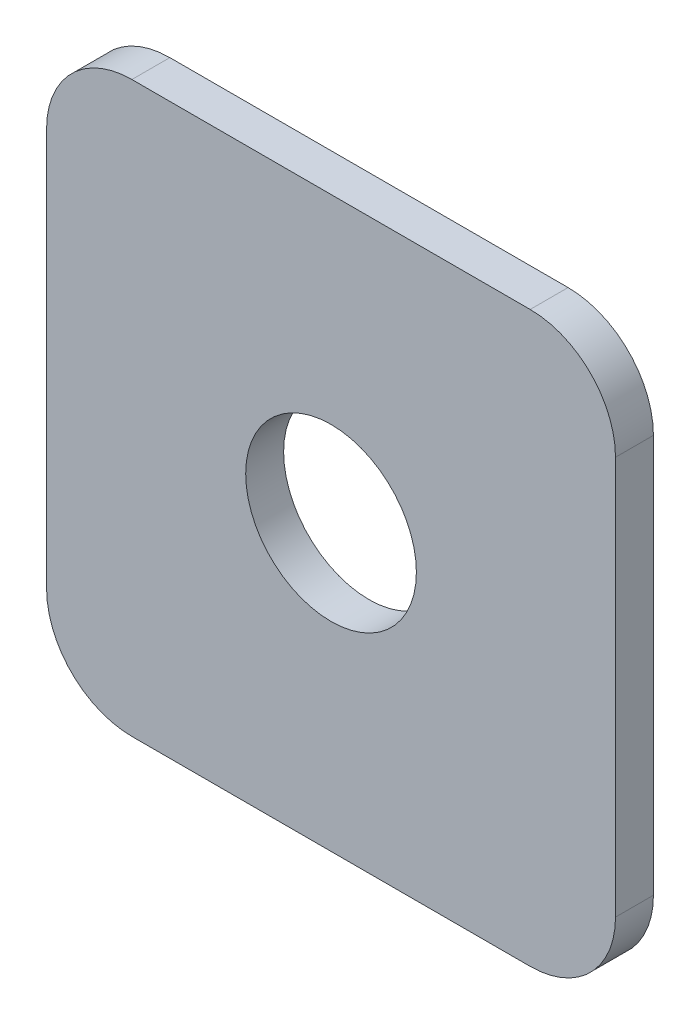
ISO-10303-21;
HEADER;
FILE_DESCRIPTION(('STEP AP214'),'2;1');
FILE_NAME('part.step','',(''),(''),'','','');
FILE_SCHEMA(('AUTOMOTIVE_DESIGN { 1 0 10303 214 1 1 1 1 }'));
ENDSEC;
DATA;
#1=APPLICATION_CONTEXT('core data for automotive mechanical design processes');
#2=APPLICATION_PROTOCOL_DEFINITION('international standard','automotive_design',2000,#1);
#3=PRODUCT_CONTEXT('',#1,'mechanical');
#4=PRODUCT('Part','Part','',(#3));
#5=PRODUCT_RELATED_PRODUCT_CATEGORY('part','',(#4));
#6=PRODUCT_DEFINITION_FORMATION('','',#4);
#7=PRODUCT_DEFINITION_CONTEXT('part definition',#1,'design');
#8=PRODUCT_DEFINITION('design','',#6,#7);
#9=PRODUCT_DEFINITION_SHAPE('','',#8);
#10=(LENGTH_UNIT() NAMED_UNIT(*) SI_UNIT(.MILLI.,.METRE.));
#11=(NAMED_UNIT(*) PLANE_ANGLE_UNIT() SI_UNIT($,.RADIAN.));
#12=(NAMED_UNIT(*) SI_UNIT($,.STERADIAN.) SOLID_ANGLE_UNIT());
#13=UNCERTAINTY_MEASURE_WITH_UNIT(LENGTH_MEASURE(1.E-05),#10,'distance_accuracy_value','');
#14=(GEOMETRIC_REPRESENTATION_CONTEXT(3) GLOBAL_UNCERTAINTY_ASSIGNED_CONTEXT((#13)) GLOBAL_UNIT_ASSIGNED_CONTEXT((#10,
#11,#12)) REPRESENTATION_CONTEXT('',''));
#15=CARTESIAN_POINT('',(0.,0.,0.));
#16=DIRECTION('',(0.,0.,1.));
#17=DIRECTION('',(1.,0.,0.));
#18=AXIS2_PLACEMENT_3D('',#15,#16,#17);
#19=CARTESIAN_POINT('',(0.,0.,10.));
#20=DIRECTION('',(0.,0.,-1.));
#21=DIRECTION('',(-1.,0.,0.));
#22=AXIS2_PLACEMENT_3D('',#19,#20,#21);
#23=PLANE('',#22);
#24=DIRECTION('',(-1.,0.,0.));
#25=VECTOR('',#24,1.);
#26=CARTESIAN_POINT('',(0.,150.,10.));
#27=LINE('',#26,#25);
#28=CARTESIAN_POINT('',(127.5,150.,10.));
#29=VERTEX_POINT('',#28);
#30=CARTESIAN_POINT('',(22.5,150.,10.));
#31=VERTEX_POINT('',#30);
#32=EDGE_CURVE('E136',#29,#31,#27,.T.);
#33=ORIENTED_EDGE('',*,*,#32,.T.);
#34=CARTESIAN_POINT('',(22.5,127.5,10.));
#35=DIRECTION('',(0.,0.,-1.));
#36=DIRECTION('',(-1.,0.,0.));
#37=AXIS2_PLACEMENT_3D('',#34,#35,#36);
#38=CIRCLE('',#37,22.5);
#39=CARTESIAN_POINT('',(0.,127.5,10.));
#40=VERTEX_POINT('',#39);
#41=EDGE_CURVE('E155',#31,#40,#38,.F.);
#42=ORIENTED_EDGE('',*,*,#41,.T.);
#43=DIRECTION('',(0.,-1.,0.));
#44=VECTOR('',#43,1.);
#45=CARTESIAN_POINT('',(0.,0.,10.));
#46=LINE('',#45,#44);
#47=CARTESIAN_POINT('',(0.,22.5,10.));
#48=VERTEX_POINT('',#47);
#49=EDGE_CURVE('E119',#40,#48,#46,.T.);
#50=ORIENTED_EDGE('',*,*,#49,.T.);
#51=CARTESIAN_POINT('',(22.5,22.5,10.));
#52=DIRECTION('',(0.,0.,-1.));
#53=DIRECTION('',(-1.,0.,0.));
#54=AXIS2_PLACEMENT_3D('',#51,#52,#53);
#55=CIRCLE('',#54,22.5);
#56=CARTESIAN_POINT('',(22.5,0.,10.));
#57=VERTEX_POINT('',#56);
#58=EDGE_CURVE('E153',#48,#57,#55,.F.);
#59=ORIENTED_EDGE('',*,*,#58,.T.);
#60=DIRECTION('',(1.,0.,0.));
#61=VECTOR('',#60,1.);
#62=CARTESIAN_POINT('',(0.,0.,10.));
#63=LINE('',#62,#61);
#64=CARTESIAN_POINT('',(127.5,0.,10.));
#65=VERTEX_POINT('',#64);
#66=EDGE_CURVE('E166',#57,#65,#63,.T.);
#67=ORIENTED_EDGE('',*,*,#66,.T.);
#68=CARTESIAN_POINT('',(127.5,22.5,10.));
#69=DIRECTION('',(0.,0.,-1.));
#70=DIRECTION('',(-1.,0.,0.));
#71=AXIS2_PLACEMENT_3D('',#68,#69,#70);
#72=CIRCLE('',#71,22.5);
#73=CARTESIAN_POINT('',(150.,22.5,10.));
#74=VERTEX_POINT('',#73);
#75=EDGE_CURVE('E54',#65,#74,#72,.F.);
#76=ORIENTED_EDGE('',*,*,#75,.T.);
#77=DIRECTION('',(0.,1.,0.));
#78=VECTOR('',#77,1.);
#79=CARTESIAN_POINT('',(150.,0.,10.));
#80=LINE('',#79,#78);
#81=CARTESIAN_POINT('',(150.,127.5,10.));
#82=VERTEX_POINT('',#81);
#83=EDGE_CURVE('E174',#74,#82,#80,.T.);
#84=ORIENTED_EDGE('',*,*,#83,.T.);
#85=CARTESIAN_POINT('',(127.5,127.5,10.));
#86=DIRECTION('',(0.,0.,-1.));
#87=DIRECTION('',(-1.,0.,0.));
#88=AXIS2_PLACEMENT_3D('',#85,#86,#87);
#89=CIRCLE('',#88,22.5);
#90=EDGE_CURVE('E150',#82,#29,#89,.F.);
#91=ORIENTED_EDGE('',*,*,#90,.T.);
#92=EDGE_LOOP('',(#33,#42,#50,#59,#67,#76,#84,#91));
#93=FACE_BOUND('',#92,.T.);
#94=CARTESIAN_POINT('',(75.,75.,10.));
#95=DIRECTION('',(0.,0.,1.));
#96=DIRECTION('',(1.,0.,0.));
#97=AXIS2_PLACEMENT_3D('',#94,#95,#96);
#98=CIRCLE('',#97,22.5);
#99=CARTESIAN_POINT('',(97.5,75.,10.));
#100=VERTEX_POINT('',#99);
#101=EDGE_CURVE('E127',#100,#100,#98,.T.);
#102=ORIENTED_EDGE('',*,*,#101,.F.);
#103=EDGE_LOOP('',(#102));
#104=FACE_BOUND('',#103,.T.);
#105=ADVANCED_FACE('F33',(#93,#104),#23,.F.);
#106=CARTESIAN_POINT('',(0.,0.,0.));
#107=DIRECTION('',(0.,0.,-1.));
#108=DIRECTION('',(-1.,0.,0.));
#109=AXIS2_PLACEMENT_3D('',#106,#107,#108);
#110=PLANE('',#109);
#111=DIRECTION('',(0.,-1.,0.));
#112=VECTOR('',#111,1.);
#113=CARTESIAN_POINT('',(0.,0.,0.));
#114=LINE('',#113,#112);
#115=CARTESIAN_POINT('',(0.,127.5,0.));
#116=VERTEX_POINT('',#115);
#117=CARTESIAN_POINT('',(0.,22.5,0.));
#118=VERTEX_POINT('',#117);
#119=EDGE_CURVE('E116',#116,#118,#114,.T.);
#120=ORIENTED_EDGE('',*,*,#119,.F.);
#121=CARTESIAN_POINT('',(22.5,127.5,0.));
#122=DIRECTION('',(0.,0.,-1.));
#123=DIRECTION('',(-1.,0.,0.));
#124=AXIS2_PLACEMENT_3D('',#121,#122,#123);
#125=CIRCLE('',#124,22.5);
#126=CARTESIAN_POINT('',(22.5,150.,0.));
#127=VERTEX_POINT('',#126);
#128=EDGE_CURVE('E99',#116,#127,#125,.T.);
#129=ORIENTED_EDGE('',*,*,#128,.T.);
#130=DIRECTION('',(-1.,0.,0.));
#131=VECTOR('',#130,1.);
#132=CARTESIAN_POINT('',(0.,150.,0.));
#133=LINE('',#132,#131);
#134=CARTESIAN_POINT('',(127.5,150.,0.));
#135=VERTEX_POINT('',#134);
#136=EDGE_CURVE('E140',#135,#127,#133,.T.);
#137=ORIENTED_EDGE('',*,*,#136,.F.);
#138=CARTESIAN_POINT('',(127.5,127.5,0.));
#139=DIRECTION('',(0.,0.,-1.));
#140=DIRECTION('',(-1.,0.,0.));
#141=AXIS2_PLACEMENT_3D('',#138,#139,#140);
#142=CIRCLE('',#141,22.5);
#143=CARTESIAN_POINT('',(150.,127.5,0.));
#144=VERTEX_POINT('',#143);
#145=EDGE_CURVE('E120',#135,#144,#142,.T.);
#146=ORIENTED_EDGE('',*,*,#145,.T.);
#147=DIRECTION('',(0.,1.,0.));
#148=VECTOR('',#147,1.);
#149=CARTESIAN_POINT('',(150.,0.,0.));
#150=LINE('',#149,#148);
#151=CARTESIAN_POINT('',(150.,22.5,0.));
#152=VERTEX_POINT('',#151);
#153=EDGE_CURVE('E130',#152,#144,#150,.T.);
#154=ORIENTED_EDGE('',*,*,#153,.F.);
#155=CARTESIAN_POINT('',(127.5,22.5,0.));
#156=DIRECTION('',(0.,0.,-1.));
#157=DIRECTION('',(-1.,0.,0.));
#158=AXIS2_PLACEMENT_3D('',#155,#156,#157);
#159=CIRCLE('',#158,22.5);
#160=CARTESIAN_POINT('',(127.5,0.,0.));
#161=VERTEX_POINT('',#160);
#162=EDGE_CURVE('E144',#152,#161,#159,.T.);
#163=ORIENTED_EDGE('',*,*,#162,.T.);
#164=DIRECTION('',(1.,0.,0.));
#165=VECTOR('',#164,1.);
#166=CARTESIAN_POINT('',(0.,0.,0.));
#167=LINE('',#166,#165);
#168=CARTESIAN_POINT('',(22.5,0.,0.));
#169=VERTEX_POINT('',#168);
#170=EDGE_CURVE('E126',#169,#161,#167,.T.);
#171=ORIENTED_EDGE('',*,*,#170,.F.);
#172=CARTESIAN_POINT('',(22.5,22.5,0.));
#173=DIRECTION('',(0.,0.,-1.));
#174=DIRECTION('',(-1.,0.,0.));
#175=AXIS2_PLACEMENT_3D('',#172,#173,#174);
#176=CIRCLE('',#175,22.5);
#177=EDGE_CURVE('E110',#169,#118,#176,.T.);
#178=ORIENTED_EDGE('',*,*,#177,.T.);
#179=EDGE_LOOP('',(#120,#129,#137,#146,#154,#163,#171,#178));
#180=FACE_BOUND('',#179,.T.);
#181=CARTESIAN_POINT('',(75.,75.,0.));
#182=DIRECTION('',(0.,0.,1.));
#183=DIRECTION('',(1.,0.,0.));
#184=AXIS2_PLACEMENT_3D('',#181,#182,#183);
#185=CIRCLE('',#184,22.5);
#186=CARTESIAN_POINT('',(97.5,75.,0.));
#187=VERTEX_POINT('',#186);
#188=EDGE_CURVE('E133',#187,#187,#185,.T.);
#189=ORIENTED_EDGE('',*,*,#188,.T.);
#190=EDGE_LOOP('',(#189));
#191=FACE_BOUND('',#190,.T.);
#192=ADVANCED_FACE('F123',(#180,#191),#110,.T.);
#193=CARTESIAN_POINT('',(0.,0.,10.));
#194=DIRECTION('',(1.,0.,0.));
#195=DIRECTION('',(0.,0.,-1.));
#196=AXIS2_PLACEMENT_3D('',#193,#194,#195);
#197=PLANE('',#196);
#198=ORIENTED_EDGE('',*,*,#49,.F.);
#199=DIRECTION('',(0.,0.,-1.));
#200=VECTOR('',#199,1.);
#201=CARTESIAN_POINT('',(0.,127.5,10.));
#202=LINE('',#201,#200);
#203=EDGE_CURVE('E103',#40,#116,#202,.T.);
#204=ORIENTED_EDGE('',*,*,#203,.T.);
#205=ORIENTED_EDGE('',*,*,#119,.T.);
#206=DIRECTION('',(0.,0.,-1.));
#207=VECTOR('',#206,1.);
#208=CARTESIAN_POINT('',(0.,22.5,10.));
#209=LINE('',#208,#207);
#210=EDGE_CURVE('E121',#118,#48,#209,.F.);
#211=ORIENTED_EDGE('',*,*,#210,.T.);
#212=EDGE_LOOP('',(#198,#204,#205,#211));
#213=FACE_BOUND('',#212,.T.);
#214=ADVANCED_FACE('F115',(#213),#197,.F.);
#215=CARTESIAN_POINT('',(0.,0.,10.));
#216=DIRECTION('',(0.,1.,0.));
#217=DIRECTION('',(0.,0.,1.));
#218=AXIS2_PLACEMENT_3D('',#215,#216,#217);
#219=PLANE('',#218);
#220=ORIENTED_EDGE('',*,*,#66,.F.);
#221=DIRECTION('',(0.,0.,-1.));
#222=VECTOR('',#221,1.);
#223=CARTESIAN_POINT('',(22.5,0.,10.));
#224=LINE('',#223,#222);
#225=EDGE_CURVE('E159',#57,#169,#224,.T.);
#226=ORIENTED_EDGE('',*,*,#225,.T.);
#227=ORIENTED_EDGE('',*,*,#170,.T.);
#228=DIRECTION('',(0.,0.,-1.));
#229=VECTOR('',#228,1.);
#230=CARTESIAN_POINT('',(127.5,0.,10.));
#231=LINE('',#230,#229);
#232=EDGE_CURVE('E157',#161,#65,#231,.F.);
#233=ORIENTED_EDGE('',*,*,#232,.T.);
#234=EDGE_LOOP('',(#220,#226,#227,#233));
#235=FACE_BOUND('',#234,.T.);
#236=ADVANCED_FACE('F164',(#235),#219,.F.);
#237=CARTESIAN_POINT('',(150.,0.,10.));
#238=DIRECTION('',(-1.,0.,0.));
#239=DIRECTION('',(0.,0.,1.));
#240=AXIS2_PLACEMENT_3D('',#237,#238,#239);
#241=PLANE('',#240);
#242=ORIENTED_EDGE('',*,*,#83,.F.);
#243=DIRECTION('',(0.,0.,-1.));
#244=VECTOR('',#243,1.);
#245=CARTESIAN_POINT('',(150.,22.5,10.));
#246=LINE('',#245,#244);
#247=EDGE_CURVE('E11',#74,#152,#246,.T.);
#248=ORIENTED_EDGE('',*,*,#247,.T.);
#249=ORIENTED_EDGE('',*,*,#153,.T.);
#250=DIRECTION('',(0.,0.,-1.));
#251=VECTOR('',#250,1.);
#252=CARTESIAN_POINT('',(150.,127.5,10.));
#253=LINE('',#252,#251);
#254=EDGE_CURVE('E41',#144,#82,#253,.F.);
#255=ORIENTED_EDGE('',*,*,#254,.T.);
#256=EDGE_LOOP('',(#242,#248,#249,#255));
#257=FACE_BOUND('',#256,.T.);
#258=ADVANCED_FACE('F173',(#257),#241,.F.);
#259=CARTESIAN_POINT('',(0.,150.,10.));
#260=DIRECTION('',(0.,-1.,0.));
#261=DIRECTION('',(0.,0.,-1.));
#262=AXIS2_PLACEMENT_3D('',#259,#260,#261);
#263=PLANE('',#262);
#264=ORIENTED_EDGE('',*,*,#136,.T.);
#265=DIRECTION('',(0.,0.,-1.));
#266=VECTOR('',#265,1.);
#267=CARTESIAN_POINT('',(22.5,150.,10.));
#268=LINE('',#267,#266);
#269=EDGE_CURVE('E104',#127,#31,#268,.F.);
#270=ORIENTED_EDGE('',*,*,#269,.T.);
#271=ORIENTED_EDGE('',*,*,#32,.F.);
#272=DIRECTION('',(0.,0.,-1.));
#273=VECTOR('',#272,1.);
#274=CARTESIAN_POINT('',(127.5,150.,10.));
#275=LINE('',#274,#273);
#276=EDGE_CURVE('E109',#29,#135,#275,.T.);
#277=ORIENTED_EDGE('',*,*,#276,.T.);
#278=EDGE_LOOP('',(#264,#270,#271,#277));
#279=FACE_BOUND('',#278,.T.);
#280=ADVANCED_FACE('F185',(#279),#263,.F.);
#281=CARTESIAN_POINT('',(75.,75.,10.));
#282=DIRECTION('',(0.,0.,-1.));
#283=DIRECTION('',(-1.,0.,0.));
#284=AXIS2_PLACEMENT_3D('',#281,#282,#283);
#285=CYLINDRICAL_SURFACE('',#284,22.5);
#286=ORIENTED_EDGE('',*,*,#101,.T.);
#287=EDGE_LOOP('',(#286));
#288=FACE_BOUND('',#287,.T.);
#289=ORIENTED_EDGE('',*,*,#188,.F.);
#290=EDGE_LOOP('',(#289));
#291=FACE_BOUND('',#290,.T.);
#292=ADVANCED_FACE('F183',(#288,#291),#285,.F.);
#293=CARTESIAN_POINT('',(22.5,127.5,10.));
#294=DIRECTION('',(0.,0.,-1.));
#295=DIRECTION('',(-1.,0.,0.));
#296=AXIS2_PLACEMENT_3D('',#293,#294,#295);
#297=CYLINDRICAL_SURFACE('',#296,22.5);
#298=ORIENTED_EDGE('',*,*,#41,.F.);
#299=ORIENTED_EDGE('',*,*,#269,.F.);
#300=ORIENTED_EDGE('',*,*,#128,.F.);
#301=ORIENTED_EDGE('',*,*,#203,.F.);
#302=EDGE_LOOP('',(#298,#299,#300,#301));
#303=FACE_BOUND('',#302,.T.);
#304=ADVANCED_FACE('F102',(#303),#297,.T.);
#305=CARTESIAN_POINT('',(22.5,22.5,10.));
#306=DIRECTION('',(0.,0.,-1.));
#307=DIRECTION('',(-1.,0.,0.));
#308=AXIS2_PLACEMENT_3D('',#305,#306,#307);
#309=CYLINDRICAL_SURFACE('',#308,22.5);
#310=ORIENTED_EDGE('',*,*,#58,.F.);
#311=ORIENTED_EDGE('',*,*,#210,.F.);
#312=ORIENTED_EDGE('',*,*,#177,.F.);
#313=ORIENTED_EDGE('',*,*,#225,.F.);
#314=EDGE_LOOP('',(#310,#311,#312,#313));
#315=FACE_BOUND('',#314,.T.);
#316=ADVANCED_FACE('F192',(#315),#309,.T.);
#317=CARTESIAN_POINT('',(127.5,22.5,10.));
#318=DIRECTION('',(0.,0.,-1.));
#319=DIRECTION('',(-1.,0.,0.));
#320=AXIS2_PLACEMENT_3D('',#317,#318,#319);
#321=CYLINDRICAL_SURFACE('',#320,22.5);
#322=ORIENTED_EDGE('',*,*,#75,.F.);
#323=ORIENTED_EDGE('',*,*,#232,.F.);
#324=ORIENTED_EDGE('',*,*,#162,.F.);
#325=ORIENTED_EDGE('',*,*,#247,.F.);
#326=EDGE_LOOP('',(#322,#323,#324,#325));
#327=FACE_BOUND('',#326,.T.);
#328=ADVANCED_FACE('F172',(#327),#321,.T.);
#329=CARTESIAN_POINT('',(127.5,127.5,10.));
#330=DIRECTION('',(0.,0.,-1.));
#331=DIRECTION('',(-1.,0.,0.));
#332=AXIS2_PLACEMENT_3D('',#329,#330,#331);
#333=CYLINDRICAL_SURFACE('',#332,22.5);
#334=ORIENTED_EDGE('',*,*,#90,.F.);
#335=ORIENTED_EDGE('',*,*,#254,.F.);
#336=ORIENTED_EDGE('',*,*,#145,.F.);
#337=ORIENTED_EDGE('',*,*,#276,.F.);
#338=EDGE_LOOP('',(#334,#335,#336,#337));
#339=FACE_BOUND('',#338,.T.);
#340=ADVANCED_FACE('F35',(#339),#333,.T.);
#341=CLOSED_SHELL('',(#105,#192,#214,#236,#258,#280,#292,#304,#316,#328,#340));
#342=MANIFOLD_SOLID_BREP('B2',#341);
#343=ADVANCED_BREP_SHAPE_REPRESENTATION('',(#18,#342),#14);
#344=SHAPE_DEFINITION_REPRESENTATION(#9,#343);
ENDSEC;
END-ISO-10303-21;
